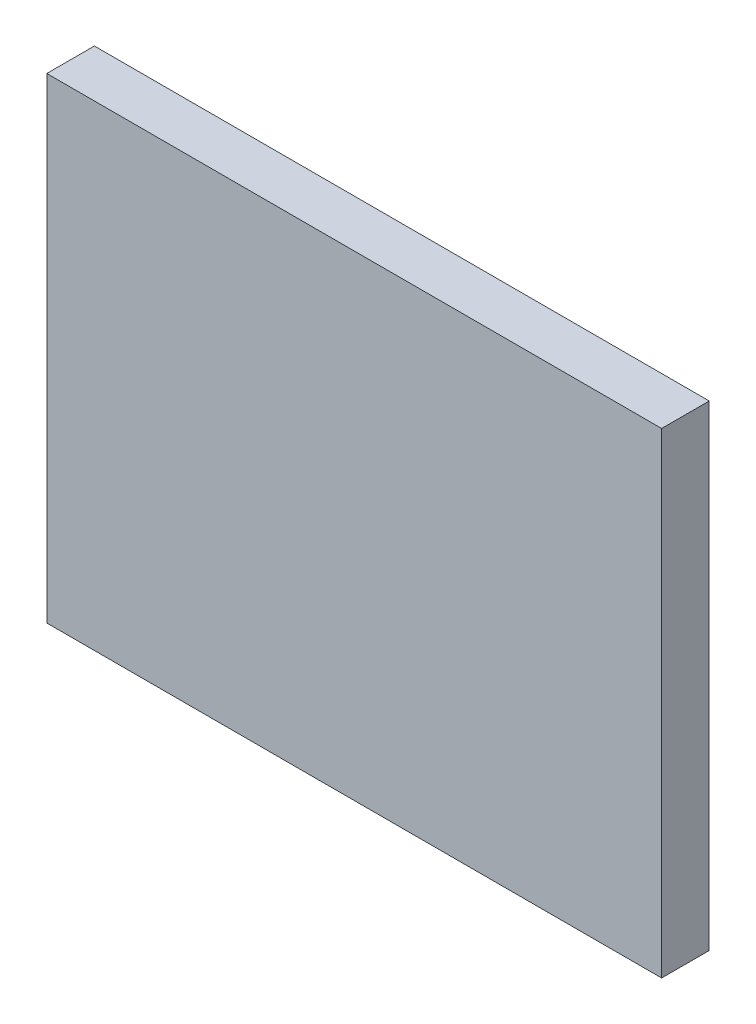
ISO-10303-21;
HEADER;
FILE_DESCRIPTION(('STEP AP214'),'2;1');
FILE_NAME('part.step','',(''),(''),'','','');
FILE_SCHEMA(('AUTOMOTIVE_DESIGN { 1 0 10303 214 1 1 1 1 }'));
ENDSEC;
DATA;
#1=APPLICATION_CONTEXT('core data for automotive mechanical design processes');
#2=APPLICATION_PROTOCOL_DEFINITION('international standard','automotive_design',2000,#1);
#3=PRODUCT_CONTEXT('',#1,'mechanical');
#4=PRODUCT('Part','Part','',(#3));
#5=PRODUCT_RELATED_PRODUCT_CATEGORY('part','',(#4));
#6=PRODUCT_DEFINITION_FORMATION('','',#4);
#7=PRODUCT_DEFINITION_CONTEXT('part definition',#1,'design');
#8=PRODUCT_DEFINITION('design','',#6,#7);
#9=PRODUCT_DEFINITION_SHAPE('','',#8);
#10=(LENGTH_UNIT() NAMED_UNIT(*) SI_UNIT(.MILLI.,.METRE.));
#11=(NAMED_UNIT(*) PLANE_ANGLE_UNIT() SI_UNIT($,.RADIAN.));
#12=(NAMED_UNIT(*) SI_UNIT($,.STERADIAN.) SOLID_ANGLE_UNIT());
#13=UNCERTAINTY_MEASURE_WITH_UNIT(LENGTH_MEASURE(1.E-05),#10,'distance_accuracy_value','');
#14=(GEOMETRIC_REPRESENTATION_CONTEXT(3) GLOBAL_UNCERTAINTY_ASSIGNED_CONTEXT((#13)) GLOBAL_UNIT_ASSIGNED_CONTEXT((#10,
#11,#12)) REPRESENTATION_CONTEXT('',''));
#15=CARTESIAN_POINT('',(0.,0.,0.));
#16=DIRECTION('',(0.,0.,1.));
#17=DIRECTION('',(1.,0.,0.));
#18=AXIS2_PLACEMENT_3D('',#15,#16,#17);
#19=CARTESIAN_POINT('',(32.2972942461088,25.,5.));
#20=DIRECTION('',(-1.,0.,0.));
#21=DIRECTION('',(0.,-1.,0.));
#22=AXIS2_PLACEMENT_3D('',#19,#20,#21);
#23=PLANE('',#22);
#24=DIRECTION('',(0.,1.,0.));
#25=VECTOR('',#24,1.);
#26=CARTESIAN_POINT('',(32.2972942461088,25.,0.));
#27=LINE('',#26,#25);
#28=CARTESIAN_POINT('',(32.2972942461088,-25.,0.));
#29=VERTEX_POINT('',#28);
#30=CARTESIAN_POINT('',(32.2972942461088,25.,0.));
#31=VERTEX_POINT('',#30);
#32=EDGE_CURVE('E96',#29,#31,#27,.T.);
#33=ORIENTED_EDGE('',*,*,#32,.T.);
#34=DIRECTION('',(0.,0.,-1.));
#35=VECTOR('',#34,1.);
#36=CARTESIAN_POINT('',(32.2972942461088,25.,5.));
#37=LINE('',#36,#35);
#38=CARTESIAN_POINT('',(32.2972942461088,25.,5.));
#39=VERTEX_POINT('',#38);
#40=EDGE_CURVE('E11',#39,#31,#37,.T.);
#41=ORIENTED_EDGE('',*,*,#40,.F.);
#42=DIRECTION('',(0.,1.,0.));
#43=VECTOR('',#42,1.);
#44=CARTESIAN_POINT('',(32.2972942461088,25.,5.));
#45=LINE('',#44,#43);
#46=CARTESIAN_POINT('',(32.2972942461088,-25.,5.));
#47=VERTEX_POINT('',#46);
#48=EDGE_CURVE('E84',#47,#39,#45,.T.);
#49=ORIENTED_EDGE('',*,*,#48,.F.);
#50=DIRECTION('',(0.,0.,-1.));
#51=VECTOR('',#50,1.);
#52=CARTESIAN_POINT('',(32.2972942461088,-25.,5.));
#53=LINE('',#52,#51);
#54=EDGE_CURVE('E92',#47,#29,#53,.T.);
#55=ORIENTED_EDGE('',*,*,#54,.T.);
#56=EDGE_LOOP('',(#33,#41,#49,#55));
#57=FACE_BOUND('',#56,.T.);
#58=ADVANCED_FACE('F33',(#57),#23,.F.);
#59=CARTESIAN_POINT('',(-32.2972942461088,25.,5.));
#60=DIRECTION('',(0.,-1.,0.));
#61=DIRECTION('',(0.,0.,-1.));
#62=AXIS2_PLACEMENT_3D('',#59,#60,#61);
#63=PLANE('',#62);
#64=DIRECTION('',(-1.,0.,0.));
#65=VECTOR('',#64,1.);
#66=CARTESIAN_POINT('',(-32.2972942461088,25.,0.));
#67=LINE('',#66,#65);
#68=CARTESIAN_POINT('',(-32.2972942461088,25.,0.));
#69=VERTEX_POINT('',#68);
#70=EDGE_CURVE('E88',#31,#69,#67,.T.);
#71=ORIENTED_EDGE('',*,*,#70,.T.);
#72=DIRECTION('',(0.,0.,-1.));
#73=VECTOR('',#72,1.);
#74=CARTESIAN_POINT('',(-32.2972942461088,25.,5.));
#75=LINE('',#74,#73);
#76=CARTESIAN_POINT('',(-32.2972942461088,25.,5.));
#77=VERTEX_POINT('',#76);
#78=EDGE_CURVE('E41',#77,#69,#75,.T.);
#79=ORIENTED_EDGE('',*,*,#78,.F.);
#80=DIRECTION('',(-1.,0.,0.));
#81=VECTOR('',#80,1.);
#82=CARTESIAN_POINT('',(-32.2972942461088,25.,5.));
#83=LINE('',#82,#81);
#84=EDGE_CURVE('E79',#39,#77,#83,.T.);
#85=ORIENTED_EDGE('',*,*,#84,.F.);
#86=ORIENTED_EDGE('',*,*,#40,.T.);
#87=EDGE_LOOP('',(#71,#79,#85,#86));
#88=FACE_BOUND('',#87,.T.);
#89=ADVANCED_FACE('F87',(#88),#63,.F.);
#90=CARTESIAN_POINT('',(-32.2972942461088,25.,5.));
#91=DIRECTION('',(1.,0.,0.));
#92=DIRECTION('',(0.,1.,0.));
#93=AXIS2_PLACEMENT_3D('',#90,#91,#92);
#94=PLANE('',#93);
#95=DIRECTION('',(0.,-1.,0.));
#96=VECTOR('',#95,1.);
#97=CARTESIAN_POINT('',(-32.2972942461088,25.,0.));
#98=LINE('',#97,#96);
#99=CARTESIAN_POINT('',(-32.2972942461088,-25.,0.));
#100=VERTEX_POINT('',#99);
#101=EDGE_CURVE('E66',#69,#100,#98,.T.);
#102=ORIENTED_EDGE('',*,*,#101,.T.);
#103=DIRECTION('',(0.,0.,-1.));
#104=VECTOR('',#103,1.);
#105=CARTESIAN_POINT('',(-32.2972942461088,-25.,5.));
#106=LINE('',#105,#104);
#107=CARTESIAN_POINT('',(-32.2972942461088,-25.,5.));
#108=VERTEX_POINT('',#107);
#109=EDGE_CURVE('E89',#108,#100,#106,.T.);
#110=ORIENTED_EDGE('',*,*,#109,.F.);
#111=DIRECTION('',(0.,-1.,0.));
#112=VECTOR('',#111,1.);
#113=CARTESIAN_POINT('',(-32.2972942461088,25.,5.));
#114=LINE('',#113,#112);
#115=EDGE_CURVE('E82',#77,#108,#114,.T.);
#116=ORIENTED_EDGE('',*,*,#115,.F.);
#117=ORIENTED_EDGE('',*,*,#78,.T.);
#118=EDGE_LOOP('',(#102,#110,#116,#117));
#119=FACE_BOUND('',#118,.T.);
#120=ADVANCED_FACE('F90',(#119),#94,.F.);
#121=CARTESIAN_POINT('',(-32.2972942461088,-25.,5.));
#122=DIRECTION('',(0.,1.,0.));
#123=DIRECTION('',(0.,0.,1.));
#124=AXIS2_PLACEMENT_3D('',#121,#122,#123);
#125=PLANE('',#124);
#126=DIRECTION('',(1.,0.,0.));
#127=VECTOR('',#126,1.);
#128=CARTESIAN_POINT('',(-32.2972942461088,-25.,0.));
#129=LINE('',#128,#127);
#130=EDGE_CURVE('E72',#100,#29,#129,.T.);
#131=ORIENTED_EDGE('',*,*,#130,.T.);
#132=ORIENTED_EDGE('',*,*,#54,.F.);
#133=DIRECTION('',(1.,0.,0.));
#134=VECTOR('',#133,1.);
#135=CARTESIAN_POINT('',(-32.2972942461088,-25.,5.));
#136=LINE('',#135,#134);
#137=EDGE_CURVE('E49',#108,#47,#136,.T.);
#138=ORIENTED_EDGE('',*,*,#137,.F.);
#139=ORIENTED_EDGE('',*,*,#109,.T.);
#140=EDGE_LOOP('',(#131,#132,#138,#139));
#141=FACE_BOUND('',#140,.T.);
#142=ADVANCED_FACE('F103',(#141),#125,.F.);
#143=CARTESIAN_POINT('',(0.,0.,5.));
#144=DIRECTION('',(0.,0.,1.));
#145=DIRECTION('',(1.,0.,0.));
#146=AXIS2_PLACEMENT_3D('',#143,#144,#145);
#147=PLANE('',#146);
#148=ORIENTED_EDGE('',*,*,#48,.T.);
#149=ORIENTED_EDGE('',*,*,#84,.T.);
#150=ORIENTED_EDGE('',*,*,#115,.T.);
#151=ORIENTED_EDGE('',*,*,#137,.T.);
#152=EDGE_LOOP('',(#148,#149,#150,#151));
#153=FACE_BOUND('',#152,.T.);
#154=ADVANCED_FACE('F80',(#153),#147,.T.);
#155=CARTESIAN_POINT('',(0.,0.,0.));
#156=DIRECTION('',(0.,0.,1.));
#157=DIRECTION('',(1.,0.,0.));
#158=AXIS2_PLACEMENT_3D('',#155,#156,#157);
#159=PLANE('',#158);
#160=ORIENTED_EDGE('',*,*,#32,.F.);
#161=ORIENTED_EDGE('',*,*,#130,.F.);
#162=ORIENTED_EDGE('',*,*,#101,.F.);
#163=ORIENTED_EDGE('',*,*,#70,.F.);
#164=EDGE_LOOP('',(#160,#161,#162,#163));
#165=FACE_BOUND('',#164,.T.);
#166=ADVANCED_FACE('F106',(#165),#159,.F.);
#167=CLOSED_SHELL('',(#58,#89,#120,#142,#154,#166));
#168=MANIFOLD_SOLID_BREP('B2',#167);
#169=ADVANCED_BREP_SHAPE_REPRESENTATION('',(#18,#168),#14);
#170=SHAPE_DEFINITION_REPRESENTATION(#9,#169);
ENDSEC;
END-ISO-10303-21;
